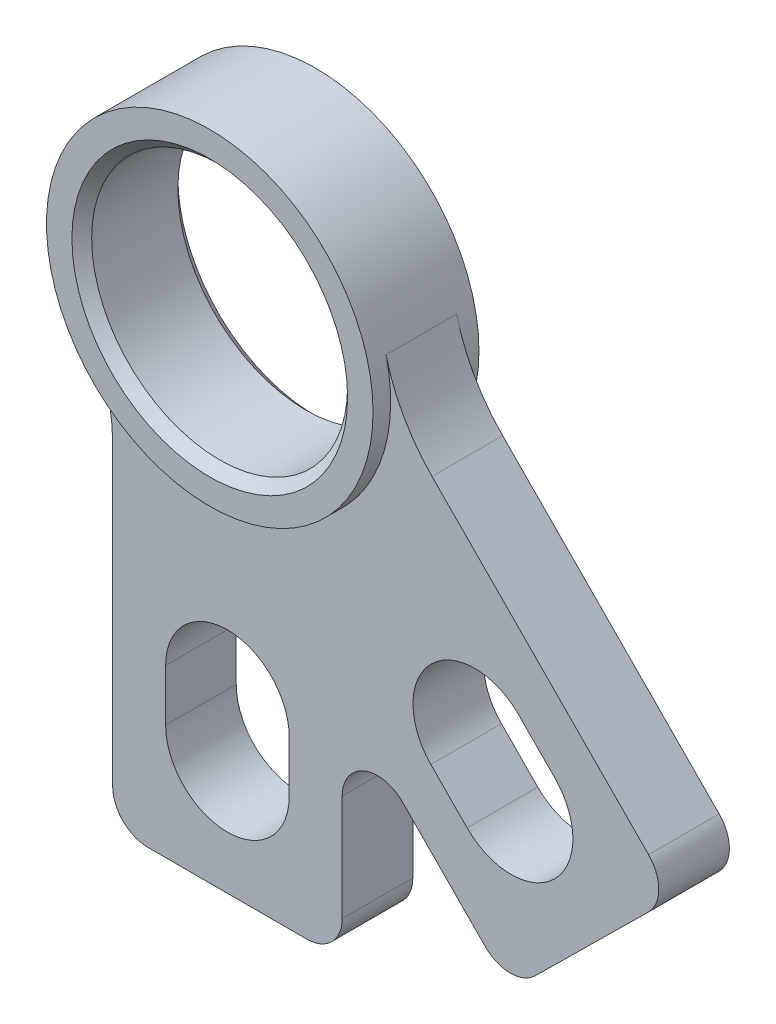
ISO-10303-21;
HEADER;
FILE_DESCRIPTION(('STEP AP214'),'2;1');
FILE_NAME('part.step','',(''),(''),'','','');
FILE_SCHEMA(('AUTOMOTIVE_DESIGN { 1 0 10303 214 1 1 1 1 }'));
ENDSEC;
DATA;
#1=APPLICATION_CONTEXT('core data for automotive mechanical design processes');
#2=APPLICATION_PROTOCOL_DEFINITION('international standard','automotive_design',2000,#1);
#3=PRODUCT_CONTEXT('',#1,'mechanical');
#4=PRODUCT('Part','Part','',(#3));
#5=PRODUCT_RELATED_PRODUCT_CATEGORY('part','',(#4));
#6=PRODUCT_DEFINITION_FORMATION('','',#4);
#7=PRODUCT_DEFINITION_CONTEXT('part definition',#1,'design');
#8=PRODUCT_DEFINITION('design','',#6,#7);
#9=PRODUCT_DEFINITION_SHAPE('','',#8);
#10=(LENGTH_UNIT() NAMED_UNIT(*) SI_UNIT(.MILLI.,.METRE.));
#11=(NAMED_UNIT(*) PLANE_ANGLE_UNIT() SI_UNIT($,.RADIAN.));
#12=(NAMED_UNIT(*) SI_UNIT($,.STERADIAN.) SOLID_ANGLE_UNIT());
#13=UNCERTAINTY_MEASURE_WITH_UNIT(LENGTH_MEASURE(1.E-05),#10,'distance_accuracy_value','');
#14=(GEOMETRIC_REPRESENTATION_CONTEXT(3) GLOBAL_UNCERTAINTY_ASSIGNED_CONTEXT((#13)) GLOBAL_UNIT_ASSIGNED_CONTEXT((#10,
#11,#12)) REPRESENTATION_CONTEXT('',''));
#15=CARTESIAN_POINT('',(0.,0.,0.));
#16=DIRECTION('',(0.,0.,1.));
#17=DIRECTION('',(1.,0.,0.));
#18=AXIS2_PLACEMENT_3D('',#15,#16,#17);
#19=CARTESIAN_POINT('',(0.,0.,4.7625));
#20=DIRECTION('',(0.,0.,-1.));
#21=DIRECTION('',(-1.,0.,0.));
#22=AXIS2_PLACEMENT_3D('',#19,#20,#21);
#23=CYLINDRICAL_SURFACE('',#22,11.5062);
#24=CARTESIAN_POINT('',(0.,0.,-3.87350000000002));
#25=DIRECTION('',(0.,0.,1.));
#26=DIRECTION('',(1.,0.,0.));
#27=AXIS2_PLACEMENT_3D('',#24,#25,#26);
#28=CIRCLE('',#27,11.5062);
#29=CARTESIAN_POINT('',(-11.5062,0.,-3.87350000000002));
#30=VERTEX_POINT('',#29);
#31=EDGE_CURVE('E43',#30,#30,#28,.F.);
#32=CARTESIAN_POINT('',(0.,0.,3.87349999999996));
#33=DIRECTION('',(0.,0.,1.));
#34=DIRECTION('',(1.,0.,0.));
#35=AXIS2_PLACEMENT_3D('',#32,#33,#34);
#36=CIRCLE('',#35,11.5062);
#37=CARTESIAN_POINT('',(-11.5062,0.,3.87349999999996));
#38=VERTEX_POINT('',#37);
#39=EDGE_CURVE('E371',#38,#38,#36,.T.);
#40=CARTESIAN_POINT('',(-11.5062,0.,-3.87350000000002));
#41=CARTESIAN_POINT('',(-11.5062,0.,-3.79280208333335));
#42=CARTESIAN_POINT('',(-11.5062,0.,-3.71210416666669));
#43=CARTESIAN_POINT('',(-11.5062,0.,-3.55070833333335));
#44=CARTESIAN_POINT('',(-11.5062,0.,-3.47001041666669));
#45=CARTESIAN_POINT('',(-11.5062,0.,-3.30861458333335));
#46=CARTESIAN_POINT('',(-11.5062,0.,-3.22791666666669));
#47=CARTESIAN_POINT('',(-11.5062,0.,-3.06652083333336));
#48=CARTESIAN_POINT('',(-11.5062,0.,-2.98582291666669));
#49=CARTESIAN_POINT('',(-11.5062,0.,-2.82442708333336));
#50=CARTESIAN_POINT('',(-11.5062,0.,-2.74372916666669));
#51=CARTESIAN_POINT('',(-11.5062,0.,-2.58233333333336));
#52=CARTESIAN_POINT('',(-11.5062,0.,-2.50163541666669));
#53=CARTESIAN_POINT('',(-11.5062,0.,-2.34023958333336));
#54=CARTESIAN_POINT('',(-11.5062,0.,-2.25954166666669));
#55=CARTESIAN_POINT('',(-11.5062,0.,-2.09814583333336));
#56=CARTESIAN_POINT('',(-11.5062,0.,-2.01744791666669));
#57=CARTESIAN_POINT('',(-11.5062,0.,-1.85605208333336));
#58=CARTESIAN_POINT('',(-11.5062,0.,-1.77535416666669));
#59=CARTESIAN_POINT('',(-11.5062,0.,-1.61395833333336));
#60=CARTESIAN_POINT('',(-11.5062,0.,-1.53326041666669));
#61=CARTESIAN_POINT('',(-11.5062,0.,-1.37186458333336));
#62=CARTESIAN_POINT('',(-11.5062,0.,-1.29116666666669));
#63=CARTESIAN_POINT('',(-11.5062,0.,-1.12977083333336));
#64=CARTESIAN_POINT('',(-11.5062,0.,-1.0490729166667));
#65=CARTESIAN_POINT('',(-11.5062,0.,-0.887677083333363));
#66=CARTESIAN_POINT('',(-11.5062,0.,-0.806979166666696));
#67=CARTESIAN_POINT('',(-11.5062,0.,-0.645583333333363));
#68=CARTESIAN_POINT('',(-11.5062,0.,-0.564885416666697));
#69=CARTESIAN_POINT('',(-11.5062,0.,-0.403489583333364));
#70=CARTESIAN_POINT('',(-11.5062,0.,-0.322791666666698));
#71=CARTESIAN_POINT('',(-11.5062,0.,-0.161395833333365));
#72=CARTESIAN_POINT('',(-11.5062,0.,-0.0806979166666985));
#73=CARTESIAN_POINT('',(-11.5062,0.,0.0806979166666343));
#74=CARTESIAN_POINT('',(-11.5062,0.,0.161395833333301));
#75=CARTESIAN_POINT('',(-11.5062,0.,0.322791666666634));
#76=CARTESIAN_POINT('',(-11.5062,0.,0.4034895833333));
#77=CARTESIAN_POINT('',(-11.5062,0.,0.564885416666633));
#78=CARTESIAN_POINT('',(-11.5062,0.,0.645583333333299));
#79=CARTESIAN_POINT('',(-11.5062,0.,0.806979166666632));
#80=CARTESIAN_POINT('',(-11.5062,0.,0.887677083333298));
#81=CARTESIAN_POINT('',(-11.5062,0.,1.04907291666663));
#82=CARTESIAN_POINT('',(-11.5062,0.,1.1297708333333));
#83=CARTESIAN_POINT('',(-11.5062,0.,1.29116666666663));
#84=CARTESIAN_POINT('',(-11.5062,0.,1.3718645833333));
#85=CARTESIAN_POINT('',(-11.5062,0.,1.53326041666663));
#86=CARTESIAN_POINT('',(-11.5062,0.,1.6139583333333));
#87=CARTESIAN_POINT('',(-11.5062,0.,1.77535416666663));
#88=CARTESIAN_POINT('',(-11.5062,0.,1.8560520833333));
#89=CARTESIAN_POINT('',(-11.5062,0.,2.01744791666663));
#90=CARTESIAN_POINT('',(-11.5062,0.,2.0981458333333));
#91=CARTESIAN_POINT('',(-11.5062,0.,2.25954166666663));
#92=CARTESIAN_POINT('',(-11.5062,0.,2.34023958333329));
#93=CARTESIAN_POINT('',(-11.5062,0.,2.50163541666663));
#94=CARTESIAN_POINT('',(-11.5062,0.,2.58233333333329));
#95=CARTESIAN_POINT('',(-11.5062,0.,2.74372916666663));
#96=CARTESIAN_POINT('',(-11.5062,0.,2.82442708333329));
#97=CARTESIAN_POINT('',(-11.5062,0.,2.98582291666663));
#98=CARTESIAN_POINT('',(-11.5062,0.,3.06652083333329));
#99=CARTESIAN_POINT('',(-11.5062,0.,3.22791666666662));
#100=CARTESIAN_POINT('',(-11.5062,0.,3.30861458333329));
#101=CARTESIAN_POINT('',(-11.5062,0.,3.47001041666662));
#102=CARTESIAN_POINT('',(-11.5062,0.,3.55070833333329));
#103=CARTESIAN_POINT('',(-11.5062,0.,3.71210416666662));
#104=CARTESIAN_POINT('',(-11.5062,0.,3.79280208333329));
#105=CARTESIAN_POINT('',(-11.5062,0.,3.87349999999996));
#106=B_SPLINE_CURVE_WITH_KNOTS('',3,(#40,#41,#42,#43,#44,#45,#46,#47,#48,#49,#50,#51,#52,#53,
#54,#55,#56,#57,#58,#59,#60,#61,#62,#63,#64,#65,#66,#67,#68,#69,#70,#71,#72,#73,#74,#75,#76,#77,
#78,#79,#80,#81,#82,#83,#84,#85,#86,#87,#88,#89,#90,#91,#92,#93,#94,#95,#96,#97,#98,#99,#100,
#101,#102,#103,#104,#105),.UNSPECIFIED.,.F.,.F.,(4,2,2,2,2,2,2,2,2,2,2,2,2,2,2,2,2,2,2,2,2,2,2,
2,2,2,2,2,2,2,2,2,4),(0.,0.24209375,0.484187499999998,0.726281249999999,0.968374999999996,
1.21046875,1.45256249999999,1.69465624999999,1.93674999999999,2.17884374999999,2.42093749999999,
2.66303124999999,2.90512499999999,3.14721874999999,3.38931249999999,3.63140624999999,
3.87349999999999,4.11559374999999,4.35768749999999,4.59978124999999,4.84187499999998,
5.08396874999998,5.32606249999998,5.56815624999998,5.81024999999998,6.05234374999998,
6.29443749999998,6.53653124999998,6.77862499999998,7.02071874999998,7.26281249999998,
7.50490624999998,7.74699999999998),.UNSPECIFIED.);
#107=EDGE_CURVE('BSEAM35',#30,#38,#106,.T.);
#108=ORIENTED_EDGE('',*,*,#31,.T.);
#109=ORIENTED_EDGE('',*,*,#39,.T.);
#110=ORIENTED_EDGE('',*,*,#107,.T.);
#111=ORIENTED_EDGE('',*,*,#107,.F.);
#112=EDGE_LOOP('',(#108,#110,#109,#111));
#113=FACE_BOUND('',#112,.T.);
#114=ADVANCED_FACE('F35',(#113),#23,.F.);
#115=CARTESIAN_POINT('',(0.,0.,4.7625));
#116=DIRECTION('',(0.,0.,-1.));
#117=DIRECTION('',(-1.,0.,0.));
#118=AXIS2_PLACEMENT_3D('',#115,#116,#117);
#119=CYLINDRICAL_SURFACE('',#118,14.6812);
#120=DIRECTION('',(0.,0.,-1.));
#121=VECTOR('',#120,1.);
#122=CARTESIAN_POINT('',(-12.5851932668321,-7.55979787272683,3.175));
#123=LINE('',#122,#121);
#124=CARTESIAN_POINT('',(-12.5851932668321,-7.55979787272682,3.175));
#125=VERTEX_POINT('',#124);
#126=CARTESIAN_POINT('',(-12.5851932668321,-7.55979787272683,-3.175));
#127=VERTEX_POINT('',#126);
#128=EDGE_CURVE('E198',#125,#127,#123,.T.);
#129=ORIENTED_EDGE('',*,*,#128,.F.);
#130=CARTESIAN_POINT('',(0.,0.,3.175));
#131=DIRECTION('',(0.,0.,1.));
#132=DIRECTION('',(1.,0.,0.));
#133=AXIS2_PLACEMENT_3D('',#130,#131,#132);
#134=CIRCLE('',#133,14.6812);
#135=CARTESIAN_POINT('',(14.2666109532849,3.46431022681427,3.175));
#136=VERTEX_POINT('',#135);
#137=EDGE_CURVE('E214',#125,#136,#134,.T.);
#138=ORIENTED_EDGE('',*,*,#137,.T.);
#139=DIRECTION('',(0.,0.,-1.));
#140=VECTOR('',#139,1.);
#141=CARTESIAN_POINT('',(14.266610953285,3.46431022681425,3.175));
#142=LINE('',#141,#140);
#143=CARTESIAN_POINT('',(14.266610953285,3.46431022681425,-3.175));
#144=VERTEX_POINT('',#143);
#145=EDGE_CURVE('E254',#136,#144,#142,.T.);
#146=ORIENTED_EDGE('',*,*,#145,.T.);
#147=CARTESIAN_POINT('',(0.,0.,-3.175));
#148=DIRECTION('',(0.,0.,1.));
#149=DIRECTION('',(1.,0.,0.));
#150=AXIS2_PLACEMENT_3D('',#147,#148,#149);
#151=CIRCLE('',#150,14.6812);
#152=EDGE_CURVE('E255',#127,#144,#151,.T.);
#153=ORIENTED_EDGE('',*,*,#152,.F.);
#154=EDGE_LOOP('',(#129,#138,#146,#153));
#155=FACE_BOUND('',#154,.T.);
#156=CARTESIAN_POINT('',(0.,0.,4.7625));
#157=DIRECTION('',(0.,0.,1.));
#158=DIRECTION('',(1.,0.,0.));
#159=AXIS2_PLACEMENT_3D('',#156,#157,#158);
#160=CIRCLE('',#159,14.6812);
#161=CARTESIAN_POINT('',(14.6812,0.,4.7625));
#162=VERTEX_POINT('',#161);
#163=EDGE_CURVE('E321',#162,#162,#160,.T.);
#164=ORIENTED_EDGE('',*,*,#163,.F.);
#165=EDGE_LOOP('',(#164));
#166=FACE_BOUND('',#165,.T.);
#167=CARTESIAN_POINT('',(0.,0.,-4.7625));
#168=DIRECTION('',(0.,0.,1.));
#169=DIRECTION('',(1.,0.,0.));
#170=AXIS2_PLACEMENT_3D('',#167,#168,#169);
#171=CIRCLE('',#170,14.6812);
#172=CARTESIAN_POINT('',(14.6812,0.,-4.7625));
#173=VERTEX_POINT('',#172);
#174=EDGE_CURVE('E309',#173,#173,#171,.T.);
#175=ORIENTED_EDGE('',*,*,#174,.T.);
#176=EDGE_LOOP('',(#175));
#177=FACE_BOUND('',#176,.T.);
#178=ADVANCED_FACE('F392',(#155,#166,#177),#119,.T.);
#179=CARTESIAN_POINT('',(0.,0.,4.7625));
#180=DIRECTION('',(0.,0.,1.));
#181=DIRECTION('',(1.,0.,0.));
#182=AXIS2_PLACEMENT_3D('',#179,#180,#181);
#183=PLANE('',#182);
#184=CARTESIAN_POINT('',(0.,0.,4.7625));
#185=DIRECTION('',(0.,0.,1.));
#186=DIRECTION('',(1.,0.,0.));
#187=AXIS2_PLACEMENT_3D('',#184,#185,#186);
#188=CIRCLE('',#187,12.3952);
#189=CARTESIAN_POINT('',(12.3952,0.,4.7625));
#190=VERTEX_POINT('',#189);
#191=EDGE_CURVE('E11',#190,#190,#188,.F.);
#192=ORIENTED_EDGE('',*,*,#191,.T.);
#193=EDGE_LOOP('',(#192));
#194=FACE_BOUND('',#193,.T.);
#195=ORIENTED_EDGE('',*,*,#163,.T.);
#196=EDGE_LOOP('',(#195));
#197=FACE_BOUND('',#196,.T.);
#198=ADVANCED_FACE('F388',(#194,#197),#183,.T.);
#199=CARTESIAN_POINT('',(0.,0.,-4.7625));
#200=DIRECTION('',(0.,0.,1.));
#201=DIRECTION('',(1.,0.,0.));
#202=AXIS2_PLACEMENT_3D('',#199,#200,#201);
#203=PLANE('',#202);
#204=CARTESIAN_POINT('',(0.,0.,-4.7625));
#205=DIRECTION('',(0.,0.,1.));
#206=DIRECTION('',(1.,0.,0.));
#207=AXIS2_PLACEMENT_3D('',#204,#205,#206);
#208=CIRCLE('',#207,12.3952);
#209=CARTESIAN_POINT('',(-12.3952,0.,-4.7625));
#210=VERTEX_POINT('',#209);
#211=EDGE_CURVE('E368',#210,#210,#208,.T.);
#212=ORIENTED_EDGE('',*,*,#211,.T.);
#213=EDGE_LOOP('',(#212));
#214=FACE_BOUND('',#213,.T.);
#215=ORIENTED_EDGE('',*,*,#174,.F.);
#216=EDGE_LOOP('',(#215));
#217=FACE_BOUND('',#216,.T.);
#218=ADVANCED_FACE('F384',(#214,#217),#203,.F.);
#219=CARTESIAN_POINT('',(0.,-30.6387499999984,3.175));
#220=DIRECTION('',(0.,0.,-1.));
#221=DIRECTION('',(-1.,0.,0.));
#222=AXIS2_PLACEMENT_3D('',#219,#220,#221);
#223=CYLINDRICAL_SURFACE('',#222,5.55624999999839);
#224=CARTESIAN_POINT('',(0.,-30.6387499999984,-3.175));
#225=DIRECTION('',(0.,0.,1.));
#226=DIRECTION('',(1.,0.,0.));
#227=AXIS2_PLACEMENT_3D('',#224,#225,#226);
#228=CIRCLE('',#227,5.55624999999839);
#229=CARTESIAN_POINT('',(5.55624999999834,-30.6387499999984,-3.175));
#230=VERTEX_POINT('',#229);
#231=CARTESIAN_POINT('',(-5.55624999999845,-30.6387499999984,-3.175));
#232=VERTEX_POINT('',#231);
#233=EDGE_CURVE('E289',#230,#232,#228,.T.);
#234=ORIENTED_EDGE('',*,*,#233,.F.);
#235=DIRECTION('',(0.,0.,-1.));
#236=VECTOR('',#235,1.);
#237=CARTESIAN_POINT('',(5.55624999999834,-30.6387499999984,3.175));
#238=LINE('',#237,#236);
#239=CARTESIAN_POINT('',(5.55624999999834,-30.6387499999984,3.175));
#240=VERTEX_POINT('',#239);
#241=EDGE_CURVE('E307',#240,#230,#238,.T.);
#242=ORIENTED_EDGE('',*,*,#241,.F.);
#243=CARTESIAN_POINT('',(0.,-30.6387499999984,3.175));
#244=DIRECTION('',(0.,0.,1.));
#245=DIRECTION('',(1.,0.,0.));
#246=AXIS2_PLACEMENT_3D('',#243,#244,#245);
#247=CIRCLE('',#246,5.55624999999839);
#248=CARTESIAN_POINT('',(-5.55624999999845,-30.6387499999984,3.175));
#249=VERTEX_POINT('',#248);
#250=EDGE_CURVE('E243',#240,#249,#247,.T.);
#251=ORIENTED_EDGE('',*,*,#250,.T.);
#252=DIRECTION('',(0.,0.,-1.));
#253=VECTOR('',#252,1.);
#254=CARTESIAN_POINT('',(-5.55624999999845,-30.6387499999984,3.175));
#255=LINE('',#254,#253);
#256=EDGE_CURVE('E300',#249,#232,#255,.T.);
#257=ORIENTED_EDGE('',*,*,#256,.T.);
#258=EDGE_LOOP('',(#234,#242,#251,#257));
#259=FACE_BOUND('',#258,.T.);
#260=ADVANCED_FACE('F387',(#259),#223,.F.);
#261=CARTESIAN_POINT('',(5.55624999999835,0.,3.175));
#262=DIRECTION('',(-1.,0.,0.));
#263=DIRECTION('',(0.,-1.,0.));
#264=AXIS2_PLACEMENT_3D('',#261,#262,#263);
#265=PLANE('',#264);
#266=DIRECTION('',(0.,1.,0.));
#267=VECTOR('',#266,1.);
#268=CARTESIAN_POINT('',(5.55624999999835,0.,-3.175));
#269=LINE('',#268,#267);
#270=CARTESIAN_POINT('',(5.55624999999834,-35.286077056792,-3.175));
#271=VERTEX_POINT('',#270);
#272=EDGE_CURVE('E292',#271,#230,#269,.T.);
#273=ORIENTED_EDGE('',*,*,#272,.F.);
#274=DIRECTION('',(0.,0.,-1.));
#275=VECTOR('',#274,1.);
#276=CARTESIAN_POINT('',(5.55624999999834,-35.286077056792,3.175));
#277=LINE('',#276,#275);
#278=CARTESIAN_POINT('',(5.55624999999834,-35.286077056792,3.175));
#279=VERTEX_POINT('',#278);
#280=EDGE_CURVE('E305',#279,#271,#277,.T.);
#281=ORIENTED_EDGE('',*,*,#280,.F.);
#282=DIRECTION('',(0.,1.,0.));
#283=VECTOR('',#282,1.);
#284=CARTESIAN_POINT('',(5.55624999999835,0.,3.175));
#285=LINE('',#284,#283);
#286=EDGE_CURVE('E246',#279,#240,#285,.T.);
#287=ORIENTED_EDGE('',*,*,#286,.T.);
#288=ORIENTED_EDGE('',*,*,#241,.T.);
#289=EDGE_LOOP('',(#273,#281,#287,#288));
#290=FACE_BOUND('',#289,.T.);
#291=ADVANCED_FACE('F530',(#290),#265,.T.);
#292=CARTESIAN_POINT('',(0.,-35.286077056792,3.175));
#293=DIRECTION('',(0.,0.,-1.));
#294=DIRECTION('',(-1.,0.,0.));
#295=AXIS2_PLACEMENT_3D('',#292,#293,#294);
#296=CYLINDRICAL_SURFACE('',#295,5.55624999999839);
#297=CARTESIAN_POINT('',(0.,-35.286077056792,-3.175));
#298=DIRECTION('',(0.,0.,1.));
#299=DIRECTION('',(1.,0.,0.));
#300=AXIS2_PLACEMENT_3D('',#297,#298,#299);
#301=CIRCLE('',#300,5.55624999999839);
#302=CARTESIAN_POINT('',(-5.55624999999845,-35.286077056792,-3.175));
#303=VERTEX_POINT('',#302);
#304=EDGE_CURVE('E295',#303,#271,#301,.T.);
#305=ORIENTED_EDGE('',*,*,#304,.F.);
#306=DIRECTION('',(0.,0.,-1.));
#307=VECTOR('',#306,1.);
#308=CARTESIAN_POINT('',(-5.55624999999845,-35.286077056792,3.175));
#309=LINE('',#308,#307);
#310=CARTESIAN_POINT('',(-5.55624999999845,-35.286077056792,3.175));
#311=VERTEX_POINT('',#310);
#312=EDGE_CURVE('E302',#311,#303,#309,.T.);
#313=ORIENTED_EDGE('',*,*,#312,.F.);
#314=CARTESIAN_POINT('',(0.,-35.286077056792,3.175));
#315=DIRECTION('',(0.,0.,1.));
#316=DIRECTION('',(1.,0.,0.));
#317=AXIS2_PLACEMENT_3D('',#314,#315,#316);
#318=CIRCLE('',#317,5.55624999999839);
#319=EDGE_CURVE('E249',#311,#279,#318,.T.);
#320=ORIENTED_EDGE('',*,*,#319,.T.);
#321=ORIENTED_EDGE('',*,*,#280,.T.);
#322=EDGE_LOOP('',(#305,#313,#320,#321));
#323=FACE_BOUND('',#322,.T.);
#324=ADVANCED_FACE('F497',(#323),#296,.F.);
#325=CARTESIAN_POINT('',(22.2428255569073,-22.5228752340236,3.175));
#326=DIRECTION('',(0.,0.,-1.));
#327=DIRECTION('',(-1.,0.,0.));
#328=AXIS2_PLACEMENT_3D('',#325,#326,#327);
#329=CYLINDRICAL_SURFACE('',#328,5.55624999999837);
#330=CARTESIAN_POINT('',(22.2428255569073,-22.5228752340236,-3.175));
#331=DIRECTION('',(0.,0.,1.));
#332=DIRECTION('',(1.,0.,0.));
#333=AXIS2_PLACEMENT_3D('',#330,#331,#332);
#334=CIRCLE('',#333,5.55624999999837);
#335=CARTESIAN_POINT('',(26.1961888126276,-18.6186681402846,-3.175));
#336=VERTEX_POINT('',#335);
#337=CARTESIAN_POINT('',(18.289462301187,-26.4270823277627,-3.175));
#338=VERTEX_POINT('',#337);
#339=EDGE_CURVE('E277',#336,#338,#334,.T.);
#340=ORIENTED_EDGE('',*,*,#339,.F.);
#341=DIRECTION('',(0.,0.,-1.));
#342=VECTOR('',#341,1.);
#343=CARTESIAN_POINT('',(26.1961888126276,-18.6186681402846,3.175));
#344=LINE('',#343,#342);
#345=CARTESIAN_POINT('',(26.1961888126276,-18.6186681402846,3.175));
#346=VERTEX_POINT('',#345);
#347=EDGE_CURVE('E303',#346,#336,#344,.T.);
#348=ORIENTED_EDGE('',*,*,#347,.F.);
#349=CARTESIAN_POINT('',(22.2428255569073,-22.5228752340236,3.175));
#350=DIRECTION('',(0.,0.,1.));
#351=DIRECTION('',(1.,0.,0.));
#352=AXIS2_PLACEMENT_3D('',#349,#350,#351);
#353=CIRCLE('',#352,5.55624999999837);
#354=CARTESIAN_POINT('',(18.289462301187,-26.4270823277627,3.175));
#355=VERTEX_POINT('',#354);
#356=EDGE_CURVE('E232',#346,#355,#353,.T.);
#357=ORIENTED_EDGE('',*,*,#356,.T.);
#358=DIRECTION('',(0.,0.,-1.));
#359=VECTOR('',#358,1.);
#360=CARTESIAN_POINT('',(18.289462301187,-26.4270823277627,3.175));
#361=LINE('',#360,#359);
#362=EDGE_CURVE('E310',#355,#338,#361,.T.);
#363=ORIENTED_EDGE('',*,*,#362,.T.);
#364=EDGE_LOOP('',(#340,#348,#357,#363));
#365=FACE_BOUND('',#364,.T.);
#366=ADVANCED_FACE('F489',(#365),#329,.F.);
#367=CARTESIAN_POINT('',(3.95336325572036,3.90420709373906,3.175));
#368=DIRECTION('',(-0.71151644647406,-0.702669443192833,0.));
#369=DIRECTION('',(0.702669443192833,-0.71151644647406,0.));
#370=AXIS2_PLACEMENT_3D('',#367,#368,#369);
#371=PLANE('',#370);
#372=DIRECTION('',(-0.702669443192833,0.71151644647406,0.));
#373=VECTOR('',#372,1.);
#374=CARTESIAN_POINT('',(3.95336325572036,3.90420709373906,-3.175));
#375=LINE('',#374,#373);
#376=CARTESIAN_POINT('',(29.4617235279598,-21.9253177733372,-3.175));
#377=VERTEX_POINT('',#376);
#378=EDGE_CURVE('E280',#377,#336,#375,.T.);
#379=ORIENTED_EDGE('',*,*,#378,.F.);
#380=DIRECTION('',(0.,0.,-1.));
#381=VECTOR('',#380,1.);
#382=CARTESIAN_POINT('',(29.4617235279598,-21.9253177733372,3.175));
#383=LINE('',#382,#381);
#384=CARTESIAN_POINT('',(29.4617235279598,-21.9253177733372,3.175));
#385=VERTEX_POINT('',#384);
#386=EDGE_CURVE('E314',#385,#377,#383,.T.);
#387=ORIENTED_EDGE('',*,*,#386,.F.);
#388=DIRECTION('',(-0.702669443192833,0.71151644647406,0.));
#389=VECTOR('',#388,1.);
#390=CARTESIAN_POINT('',(3.95336325572036,3.90420709373906,3.175));
#391=LINE('',#390,#389);
#392=EDGE_CURVE('E235',#385,#346,#391,.T.);
#393=ORIENTED_EDGE('',*,*,#392,.T.);
#394=ORIENTED_EDGE('',*,*,#347,.T.);
#395=EDGE_LOOP('',(#379,#387,#393,#394));
#396=FACE_BOUND('',#395,.T.);
#397=ADVANCED_FACE('F483',(#396),#371,.T.);
#398=CARTESIAN_POINT('',(25.5083602722395,-25.8295248670762,3.175));
#399=DIRECTION('',(0.,0.,-1.));
#400=DIRECTION('',(-1.,0.,0.));
#401=AXIS2_PLACEMENT_3D('',#398,#399,#400);
#402=CYLINDRICAL_SURFACE('',#401,5.55624999999837);
#403=CARTESIAN_POINT('',(25.5083602722395,-25.8295248670762,-3.175));
#404=DIRECTION('',(0.,0.,1.));
#405=DIRECTION('',(1.,0.,0.));
#406=AXIS2_PLACEMENT_3D('',#403,#404,#405);
#407=CIRCLE('',#406,5.55624999999837);
#408=CARTESIAN_POINT('',(21.5549970165191,-29.7337319608152,-3.175));
#409=VERTEX_POINT('',#408);
#410=EDGE_CURVE('E283',#409,#377,#407,.T.);
#411=ORIENTED_EDGE('',*,*,#410,.F.);
#412=DIRECTION('',(0.,0.,-1.));
#413=VECTOR('',#412,1.);
#414=CARTESIAN_POINT('',(21.5549970165191,-29.7337319608152,3.175));
#415=LINE('',#414,#413);
#416=CARTESIAN_POINT('',(21.5549970165191,-29.7337319608152,3.175));
#417=VERTEX_POINT('',#416);
#418=EDGE_CURVE('E312',#417,#409,#415,.T.);
#419=ORIENTED_EDGE('',*,*,#418,.F.);
#420=CARTESIAN_POINT('',(25.5083602722395,-25.8295248670762,3.175));
#421=DIRECTION('',(0.,0.,1.));
#422=DIRECTION('',(1.,0.,0.));
#423=AXIS2_PLACEMENT_3D('',#420,#421,#422);
#424=CIRCLE('',#423,5.55624999999837);
#425=EDGE_CURVE('E238',#417,#385,#424,.T.);
#426=ORIENTED_EDGE('',*,*,#425,.T.);
#427=ORIENTED_EDGE('',*,*,#386,.T.);
#428=EDGE_LOOP('',(#411,#419,#426,#427));
#429=FACE_BOUND('',#428,.T.);
#430=ADVANCED_FACE('F479',(#429),#402,.F.);
#431=CARTESIAN_POINT('',(-26.1937499999968,-15.7343197939272,3.175));
#432=DIRECTION('',(0.,0.,-1.));
#433=DIRECTION('',(-1.,0.,0.));
#434=AXIS2_PLACEMENT_3D('',#431,#432,#433);
#435=CYLINDRICAL_SURFACE('',#434,15.8749999999984);
#436=CARTESIAN_POINT('',(-26.1937499999968,-15.7343197939272,-3.175));
#437=DIRECTION('',(0.,0.,1.));
#438=DIRECTION('',(1.,0.,0.));
#439=AXIS2_PLACEMENT_3D('',#436,#437,#438);
#440=CIRCLE('',#439,15.8749999999984);
#441=CARTESIAN_POINT('',(-10.3187499999984,-15.7343197939272,-3.175));
#442=VERTEX_POINT('',#441);
#443=EDGE_CURVE('E194',#442,#127,#440,.T.);
#444=ORIENTED_EDGE('',*,*,#443,.F.);
#445=DIRECTION('',(0.,0.,-1.));
#446=VECTOR('',#445,1.);
#447=CARTESIAN_POINT('',(-10.3187499999984,-15.7343197939272,3.175));
#448=LINE('',#447,#446);
#449=CARTESIAN_POINT('',(-10.3187499999984,-15.7343197939272,3.175));
#450=VERTEX_POINT('',#449);
#451=EDGE_CURVE('E187',#450,#442,#448,.T.);
#452=ORIENTED_EDGE('',*,*,#451,.F.);
#453=CARTESIAN_POINT('',(-26.1937499999968,-15.7343197939272,3.175));
#454=DIRECTION('',(0.,0.,1.));
#455=DIRECTION('',(1.,0.,0.));
#456=AXIS2_PLACEMENT_3D('',#453,#454,#455);
#457=CIRCLE('',#456,15.8749999999984);
#458=EDGE_CURVE('E192',#450,#125,#457,.T.);
#459=ORIENTED_EDGE('',*,*,#458,.T.);
#460=ORIENTED_EDGE('',*,*,#128,.T.);
#461=EDGE_LOOP('',(#444,#452,#459,#460));
#462=FACE_BOUND('',#461,.T.);
#463=ADVANCED_FACE('F189',(#462),#435,.F.);
#464=CARTESIAN_POINT('',(-10.3187499999984,0.,3.175));
#465=DIRECTION('',(1.,0.,0.));
#466=DIRECTION('',(0.,1.,0.));
#467=AXIS2_PLACEMENT_3D('',#464,#465,#466);
#468=PLANE('',#467);
#469=DIRECTION('',(0.,-1.,0.));
#470=VECTOR('',#469,1.);
#471=CARTESIAN_POINT('',(-10.3187499999984,0.,-3.175));
#472=LINE('',#471,#470);
#473=CARTESIAN_POINT('',(-10.3187499999985,-42.4298270567904,-3.175));
#474=VERTEX_POINT('',#473);
#475=EDGE_CURVE('E259',#442,#474,#472,.T.);
#476=ORIENTED_EDGE('',*,*,#475,.T.);
#477=DIRECTION('',(0.,0.,-1.));
#478=VECTOR('',#477,1.);
#479=CARTESIAN_POINT('',(-10.3187499999985,-42.4298270567904,3.175));
#480=LINE('',#479,#478);
#481=CARTESIAN_POINT('',(-10.3187499999985,-42.4298270567904,3.175));
#482=VERTEX_POINT('',#481);
#483=EDGE_CURVE('E205',#474,#482,#480,.F.);
#484=ORIENTED_EDGE('',*,*,#483,.T.);
#485=DIRECTION('',(0.,-1.,0.));
#486=VECTOR('',#485,1.);
#487=CARTESIAN_POINT('',(-10.3187499999984,0.,3.175));
#488=LINE('',#487,#486);
#489=EDGE_CURVE('E202',#450,#482,#488,.T.);
#490=ORIENTED_EDGE('',*,*,#489,.F.);
#491=ORIENTED_EDGE('',*,*,#451,.T.);
#492=EDGE_LOOP('',(#476,#484,#490,#491));
#493=FACE_BOUND('',#492,.T.);
#494=ADVANCED_FACE('F203',(#493),#468,.F.);
#495=CARTESIAN_POINT('',(0.,-45.6048270567904,3.175));
#496=DIRECTION('',(0.,1.,0.));
#497=DIRECTION('',(-1.,0.,0.));
#498=AXIS2_PLACEMENT_3D('',#495,#496,#497);
#499=PLANE('',#498);
#500=DIRECTION('',(1.,0.,0.));
#501=VECTOR('',#500,1.);
#502=CARTESIAN_POINT('',(0.,-45.6048270567904,-3.175));
#503=LINE('',#502,#501);
#504=CARTESIAN_POINT('',(-7.14374999999846,-45.6048270567903,-3.175));
#505=VERTEX_POINT('',#504);
#506=CARTESIAN_POINT('',(7.14374999999835,-45.6048270567904,-3.175));
#507=VERTEX_POINT('',#506);
#508=EDGE_CURVE('E261',#505,#507,#503,.T.);
#509=ORIENTED_EDGE('',*,*,#508,.T.);
#510=DIRECTION('',(0.,0.,-1.));
#511=VECTOR('',#510,1.);
#512=CARTESIAN_POINT('',(7.14374999999835,-45.6048270567904,3.175));
#513=LINE('',#512,#511);
#514=CARTESIAN_POINT('',(7.14374999999835,-45.6048270567904,3.175));
#515=VERTEX_POINT('',#514);
#516=EDGE_CURVE('E58',#507,#515,#513,.F.);
#517=ORIENTED_EDGE('',*,*,#516,.T.);
#518=DIRECTION('',(1.,0.,0.));
#519=VECTOR('',#518,1.);
#520=CARTESIAN_POINT('',(0.,-45.6048270567904,3.175));
#521=LINE('',#520,#519);
#522=CARTESIAN_POINT('',(-7.14374999999846,-45.6048270567903,3.175));
#523=VERTEX_POINT('',#522);
#524=EDGE_CURVE('E207',#523,#515,#521,.T.);
#525=ORIENTED_EDGE('',*,*,#524,.F.);
#526=DIRECTION('',(0.,0.,-1.));
#527=VECTOR('',#526,1.);
#528=CARTESIAN_POINT('',(-7.14374999999846,-45.6048270567903,3.175));
#529=LINE('',#528,#527);
#530=EDGE_CURVE('E356',#523,#505,#529,.T.);
#531=ORIENTED_EDGE('',*,*,#530,.T.);
#532=EDGE_LOOP('',(#509,#517,#525,#531));
#533=FACE_BOUND('',#532,.T.);
#534=ADVANCED_FACE('F443',(#533),#499,.F.);
#535=CARTESIAN_POINT('',(10.3187499999988,-1.10175990461723E-13,3.175));
#536=DIRECTION('',(-1.,0.,0.));
#537=DIRECTION('',(0.,-1.,0.));
#538=AXIS2_PLACEMENT_3D('',#535,#536,#537);
#539=PLANE('',#538);
#540=DIRECTION('',(0.,1.,0.));
#541=VECTOR('',#540,1.);
#542=CARTESIAN_POINT('',(10.3187499999988,-1.10175990461723E-13,-3.175));
#543=LINE('',#542,#541);
#544=CARTESIAN_POINT('',(10.3187499999984,-42.4298270567904,-3.175));
#545=VERTEX_POINT('',#544);
#546=CARTESIAN_POINT('',(10.3187499999985,-32.8671970488244,-3.175));
#547=VERTEX_POINT('',#546);
#548=EDGE_CURVE('E263',#545,#547,#543,.T.);
#549=ORIENTED_EDGE('',*,*,#548,.T.);
#550=DIRECTION('',(0.,0.,-1.));
#551=VECTOR('',#550,1.);
#552=CARTESIAN_POINT('',(10.3187499999985,-32.8671970488244,3.175));
#553=LINE('',#552,#551);
#554=CARTESIAN_POINT('',(10.3187499999985,-32.8671970488244,3.175));
#555=VERTEX_POINT('',#554);
#556=EDGE_CURVE('E334',#547,#555,#553,.F.);
#557=ORIENTED_EDGE('',*,*,#556,.T.);
#558=DIRECTION('',(0.,1.,0.));
#559=VECTOR('',#558,1.);
#560=CARTESIAN_POINT('',(10.3187499999988,-1.10175990461723E-13,3.175));
#561=LINE('',#560,#559);
#562=CARTESIAN_POINT('',(10.3187499999984,-42.4298270567904,3.175));
#563=VERTEX_POINT('',#562);
#564=EDGE_CURVE('E220',#563,#555,#561,.T.);
#565=ORIENTED_EDGE('',*,*,#564,.F.);
#566=DIRECTION('',(0.,0.,-1.));
#567=VECTOR('',#566,1.);
#568=CARTESIAN_POINT('',(10.3187499999984,-42.4298270567904,3.175));
#569=LINE('',#568,#567);
#570=EDGE_CURVE('E331',#563,#545,#569,.T.);
#571=ORIENTED_EDGE('',*,*,#570,.T.);
#572=EDGE_LOOP('',(#549,#557,#565,#571));
#573=FACE_BOUND('',#572,.T.);
#574=ADVANCED_FACE('F448',(#573),#539,.F.);
#575=CARTESIAN_POINT('',(-7.34196033205303,-7.25067031694489,3.175));
#576=DIRECTION('',(-0.71151644647406,-0.702669443192833,0.));
#577=DIRECTION('',(0.702669443192833,-0.71151644647406,0.));
#578=AXIS2_PLACEMENT_3D('',#575,#576,#577);
#579=PLANE('',#578);
#580=DIRECTION('',(-0.702669443192833,0.71151644647406,0.));
#581=VECTOR('',#580,1.);
#582=CARTESIAN_POINT('',(-7.34196033205303,-7.25067031694489,3.175));
#583=LINE('',#582,#581);
#584=CARTESIAN_POINT('',(23.1860947749941,-38.163090798519,3.175));
#585=VERTEX_POINT('',#584);
#586=CARTESIAN_POINT('',(15.7528147175536,-30.6362215666872,3.175));
#587=VERTEX_POINT('',#586);
#588=EDGE_CURVE('E223',#585,#587,#583,.T.);
#589=ORIENTED_EDGE('',*,*,#588,.T.);
#590=DIRECTION('',(0.,0.,-1.));
#591=VECTOR('',#590,1.);
#592=CARTESIAN_POINT('',(15.7528147175536,-30.6362215666872,3.175));
#593=LINE('',#592,#591);
#594=CARTESIAN_POINT('',(15.7528147175536,-30.6362215666872,-3.175));
#595=VERTEX_POINT('',#594);
#596=EDGE_CURVE('E328',#587,#595,#593,.T.);
#597=ORIENTED_EDGE('',*,*,#596,.T.);
#598=DIRECTION('',(-0.702669443192833,0.71151644647406,0.));
#599=VECTOR('',#598,1.);
#600=CARTESIAN_POINT('',(-7.34196033205303,-7.25067031694489,-3.175));
#601=LINE('',#600,#599);
#602=CARTESIAN_POINT('',(23.1860947749941,-38.163090798519,-3.175));
#603=VERTEX_POINT('',#602);
#604=EDGE_CURVE('E266',#603,#595,#601,.T.);
#605=ORIENTED_EDGE('',*,*,#604,.F.);
#606=DIRECTION('',(0.,0.,-1.));
#607=VECTOR('',#606,1.);
#608=CARTESIAN_POINT('',(23.1860947749941,-38.163090798519,3.175));
#609=LINE('',#608,#607);
#610=EDGE_CURVE('E324',#603,#585,#609,.F.);
#611=ORIENTED_EDGE('',*,*,#610,.T.);
#612=EDGE_LOOP('',(#589,#597,#605,#611));
#613=FACE_BOUND('',#612,.T.);
#614=ADVANCED_FACE('F454',(#613),#579,.T.);
#615=CARTESIAN_POINT('',(32.7590305891843,-33.1714851991293,3.175));
#616=DIRECTION('',(-0.702669443192833,0.71151644647406,0.));
#617=DIRECTION('',(-0.71151644647406,-0.702669443192833,0.));
#618=AXIS2_PLACEMENT_3D('',#615,#616,#617);
#619=PLANE('',#618);
#620=DIRECTION('',(0.71151644647406,0.702669443192833,0.));
#621=VECTOR('',#620,1.);
#622=CARTESIAN_POINT('',(32.7590305891843,-33.1714851991293,3.175));
#623=LINE('',#622,#621);
#624=CARTESIAN_POINT('',(27.6761349746865,-38.1911800339369,3.175));
#625=VERTEX_POINT('',#624);
#626=CARTESIAN_POINT('',(37.8419262036823,-28.1517903643216,3.175));
#627=VERTEX_POINT('',#626);
#628=EDGE_CURVE('E226',#625,#627,#623,.T.);
#629=ORIENTED_EDGE('',*,*,#628,.F.);
#630=DIRECTION('',(0.,0.,-1.));
#631=VECTOR('',#630,1.);
#632=CARTESIAN_POINT('',(27.6761349746865,-38.1911800339369,-3.175));
#633=LINE('',#632,#631);
#634=CARTESIAN_POINT('',(27.6761349746865,-38.1911800339369,-3.175));
#635=VERTEX_POINT('',#634);
#636=EDGE_CURVE('E338',#625,#635,#633,.T.);
#637=ORIENTED_EDGE('',*,*,#636,.T.);
#638=DIRECTION('',(0.71151644647406,0.702669443192833,0.));
#639=VECTOR('',#638,1.);
#640=CARTESIAN_POINT('',(32.7590305891843,-33.1714851991293,-3.175));
#641=LINE('',#640,#639);
#642=CARTESIAN_POINT('',(37.8419262036823,-28.1517903643216,-3.175));
#643=VERTEX_POINT('',#642);
#644=EDGE_CURVE('E269',#635,#643,#641,.T.);
#645=ORIENTED_EDGE('',*,*,#644,.T.);
#646=DIRECTION('',(0.,0.,-1.));
#647=VECTOR('',#646,1.);
#648=CARTESIAN_POINT('',(37.8419262036823,-28.1517903643216,3.175));
#649=LINE('',#648,#647);
#650=EDGE_CURVE('E336',#643,#627,#649,.F.);
#651=ORIENTED_EDGE('',*,*,#650,.T.);
#652=EDGE_LOOP('',(#629,#637,#645,#651));
#653=FACE_BOUND('',#652,.T.);
#654=ADVANCED_FACE('F460',(#653),#619,.F.);
#655=CARTESIAN_POINT('',(7.34196033205295,7.25067031694487,3.175));
#656=DIRECTION('',(-0.711516446474057,-0.702669443192836,0.));
#657=DIRECTION('',(0.702669443192836,-0.711516446474057,0.));
#658=AXIS2_PLACEMENT_3D('',#655,#656,#657);
#659=PLANE('',#658);
#660=DIRECTION('',(-0.702669443192836,0.711516446474057,0.));
#661=VECTOR('',#660,1.);
#662=CARTESIAN_POINT('',(7.34196033205295,7.25067031694487,3.175));
#663=LINE('',#662,#661);
#664=CARTESIAN_POINT('',(37.8700154391002,-23.6617501646292,3.175));
#665=VERTEX_POINT('',#664);
#666=CARTESIAN_POINT('',(18.3979860606699,-3.94455699051674,3.175));
#667=VERTEX_POINT('',#666);
#668=EDGE_CURVE('E228',#665,#667,#663,.T.);
#669=ORIENTED_EDGE('',*,*,#668,.F.);
#670=DIRECTION('',(0.,0.,-1.));
#671=VECTOR('',#670,1.);
#672=CARTESIAN_POINT('',(37.8700154391002,-23.6617501646292,3.175));
#673=LINE('',#672,#671);
#674=CARTESIAN_POINT('',(37.8700154391002,-23.6617501646292,-3.175));
#675=VERTEX_POINT('',#674);
#676=EDGE_CURVE('E361',#665,#675,#673,.T.);
#677=ORIENTED_EDGE('',*,*,#676,.T.);
#678=DIRECTION('',(-0.702669443192836,0.711516446474057,0.));
#679=VECTOR('',#678,1.);
#680=CARTESIAN_POINT('',(7.34196033205295,7.25067031694487,-3.175));
#681=LINE('',#680,#679);
#682=CARTESIAN_POINT('',(18.3979860606699,-3.94455699051674,-3.175));
#683=VERTEX_POINT('',#682);
#684=EDGE_CURVE('E272',#675,#683,#681,.T.);
#685=ORIENTED_EDGE('',*,*,#684,.T.);
#686=DIRECTION('',(0.,0.,-1.));
#687=VECTOR('',#686,1.);
#688=CARTESIAN_POINT('',(18.3979860606699,-3.94455699051674,3.175));
#689=LINE('',#688,#687);
#690=EDGE_CURVE('E199',#667,#683,#689,.T.);
#691=ORIENTED_EDGE('',*,*,#690,.F.);
#692=EDGE_LOOP('',(#669,#677,#685,#691));
#693=FACE_BOUND('',#692,.T.);
#694=ADVANCED_FACE('F430',(#693),#659,.F.);
#695=CARTESIAN_POINT('',(-3.95336325572032,-3.90420709373901,3.175));
#696=DIRECTION('',(-0.71151644647406,-0.702669443192833,0.));
#697=DIRECTION('',(0.702669443192833,-0.71151644647406,0.));
#698=AXIS2_PLACEMENT_3D('',#695,#696,#697);
#699=PLANE('',#698);
#700=DIRECTION('',(-0.702669443192833,0.71151644647406,0.));
#701=VECTOR('',#700,1.);
#702=CARTESIAN_POINT('',(-3.95336325572032,-3.90420709373901,-3.175));
#703=LINE('',#702,#701);
#704=EDGE_CURVE('E286',#409,#338,#703,.T.);
#705=ORIENTED_EDGE('',*,*,#704,.T.);
#706=ORIENTED_EDGE('',*,*,#362,.F.);
#707=DIRECTION('',(-0.702669443192833,0.71151644647406,0.));
#708=VECTOR('',#707,1.);
#709=CARTESIAN_POINT('',(-3.95336325572032,-3.90420709373901,3.175));
#710=LINE('',#709,#708);
#711=EDGE_CURVE('E241',#417,#355,#710,.T.);
#712=ORIENTED_EDGE('',*,*,#711,.F.);
#713=ORIENTED_EDGE('',*,*,#418,.T.);
#714=EDGE_LOOP('',(#705,#706,#712,#713));
#715=FACE_BOUND('',#714,.T.);
#716=ADVANCED_FACE('F467',(#715),#699,.F.);
#717=CARTESIAN_POINT('',(29.6933096484445,7.21032042016844,3.175));
#718=DIRECTION('',(0.,0.,-1.));
#719=DIRECTION('',(-1.,0.,0.));
#720=AXIS2_PLACEMENT_3D('',#717,#718,#719);
#721=CYLINDRICAL_SURFACE('',#720,15.8749999999984);
#722=CARTESIAN_POINT('',(29.6933096484445,7.21032042016844,-3.175));
#723=DIRECTION('',(0.,0.,1.));
#724=DIRECTION('',(1.,0.,0.));
#725=AXIS2_PLACEMENT_3D('',#722,#723,#724);
#726=CIRCLE('',#725,15.8749999999984);
#727=EDGE_CURVE('E274',#683,#144,#726,.F.);
#728=ORIENTED_EDGE('',*,*,#727,.T.);
#729=ORIENTED_EDGE('',*,*,#145,.F.);
#730=CARTESIAN_POINT('',(29.6933096484445,7.21032042016844,3.175));
#731=DIRECTION('',(0.,0.,1.));
#732=DIRECTION('',(1.,0.,0.));
#733=AXIS2_PLACEMENT_3D('',#730,#731,#732);
#734=CIRCLE('',#733,15.8749999999984);
#735=EDGE_CURVE('E230',#667,#136,#734,.F.);
#736=ORIENTED_EDGE('',*,*,#735,.F.);
#737=ORIENTED_EDGE('',*,*,#690,.T.);
#738=EDGE_LOOP('',(#728,#729,#736,#737));
#739=FACE_BOUND('',#738,.T.);
#740=ADVANCED_FACE('F438',(#739),#721,.F.);
#741=CARTESIAN_POINT('',(-5.55624999999844,0.,3.175));
#742=DIRECTION('',(-1.,0.,0.));
#743=DIRECTION('',(0.,-1.,0.));
#744=AXIS2_PLACEMENT_3D('',#741,#742,#743);
#745=PLANE('',#744);
#746=DIRECTION('',(0.,1.,0.));
#747=VECTOR('',#746,1.);
#748=CARTESIAN_POINT('',(-5.55624999999844,0.,-3.175));
#749=LINE('',#748,#747);
#750=EDGE_CURVE('E216',#303,#232,#749,.T.);
#751=ORIENTED_EDGE('',*,*,#750,.T.);
#752=ORIENTED_EDGE('',*,*,#256,.F.);
#753=DIRECTION('',(0.,1.,0.));
#754=VECTOR('',#753,1.);
#755=CARTESIAN_POINT('',(-5.55624999999844,0.,3.175));
#756=LINE('',#755,#754);
#757=EDGE_CURVE('E252',#311,#249,#756,.T.);
#758=ORIENTED_EDGE('',*,*,#757,.F.);
#759=ORIENTED_EDGE('',*,*,#312,.T.);
#760=EDGE_LOOP('',(#751,#752,#758,#759));
#761=FACE_BOUND('',#760,.T.);
#762=ADVANCED_FACE('F500',(#761),#745,.F.);
#763=CARTESIAN_POINT('',(0.,0.,3.175));
#764=DIRECTION('',(0.,0.,1.));
#765=DIRECTION('',(1.,0.,0.));
#766=AXIS2_PLACEMENT_3D('',#763,#764,#765);
#767=PLANE('',#766);
#768=ORIENTED_EDGE('',*,*,#588,.F.);
#769=CARTESIAN_POINT('',(25.4451594925492,-35.9321153163818,3.175));
#770=DIRECTION('',(0.,0.,1.));
#771=DIRECTION('',(1.,0.,0.));
#772=AXIS2_PLACEMENT_3D('',#769,#770,#771);
#773=CIRCLE('',#772,3.175);
#774=EDGE_CURVE('E354',#585,#625,#773,.T.);
#775=ORIENTED_EDGE('',*,*,#774,.T.);
#776=ORIENTED_EDGE('',*,*,#628,.T.);
#777=CARTESIAN_POINT('',(35.6109507215451,-25.8927256467664,3.175));
#778=DIRECTION('',(0.,0.,1.));
#779=DIRECTION('',(1.,0.,0.));
#780=AXIS2_PLACEMENT_3D('',#777,#778,#779);
#781=CIRCLE('',#780,3.175);
#782=EDGE_CURVE('E50',#627,#665,#781,.T.);
#783=ORIENTED_EDGE('',*,*,#782,.T.);
#784=ORIENTED_EDGE('',*,*,#668,.T.);
#785=ORIENTED_EDGE('',*,*,#735,.T.);
#786=ORIENTED_EDGE('',*,*,#137,.F.);
#787=ORIENTED_EDGE('',*,*,#458,.F.);
#788=ORIENTED_EDGE('',*,*,#489,.T.);
#789=CARTESIAN_POINT('',(-7.14374999999845,-42.4298270567904,3.175));
#790=DIRECTION('',(0.,0.,1.));
#791=DIRECTION('',(1.,0.,0.));
#792=AXIS2_PLACEMENT_3D('',#789,#790,#791);
#793=CIRCLE('',#792,3.175);
#794=EDGE_CURVE('E350',#482,#523,#793,.T.);
#795=ORIENTED_EDGE('',*,*,#794,.T.);
#796=ORIENTED_EDGE('',*,*,#524,.T.);
#797=CARTESIAN_POINT('',(7.14374999999836,-42.4298270567904,3.175));
#798=DIRECTION('',(0.,0.,1.));
#799=DIRECTION('',(1.,0.,0.));
#800=AXIS2_PLACEMENT_3D('',#797,#798,#799);
#801=CIRCLE('',#800,3.175);
#802=EDGE_CURVE('E352',#515,#563,#801,.T.);
#803=ORIENTED_EDGE('',*,*,#802,.T.);
#804=ORIENTED_EDGE('',*,*,#564,.T.);
#805=CARTESIAN_POINT('',(13.4937499999985,-32.8671970488244,3.175));
#806=DIRECTION('',(0.,0.,1.));
#807=DIRECTION('',(1.,0.,0.));
#808=AXIS2_PLACEMENT_3D('',#805,#806,#807);
#809=CIRCLE('',#808,3.175);
#810=EDGE_CURVE('E366',#555,#587,#809,.F.);
#811=ORIENTED_EDGE('',*,*,#810,.T.);
#812=EDGE_LOOP('',(#768,#775,#776,#783,#784,#785,#786,#787,#788,#795,#796,#803,#804,#811));
#813=FACE_BOUND('',#812,.T.);
#814=ORIENTED_EDGE('',*,*,#356,.F.);
#815=ORIENTED_EDGE('',*,*,#392,.F.);
#816=ORIENTED_EDGE('',*,*,#425,.F.);
#817=ORIENTED_EDGE('',*,*,#711,.T.);
#818=EDGE_LOOP('',(#814,#815,#816,#817));
#819=FACE_BOUND('',#818,.T.);
#820=ORIENTED_EDGE('',*,*,#250,.F.);
#821=ORIENTED_EDGE('',*,*,#286,.F.);
#822=ORIENTED_EDGE('',*,*,#319,.F.);
#823=ORIENTED_EDGE('',*,*,#757,.T.);
#824=EDGE_LOOP('',(#820,#821,#822,#823));
#825=FACE_BOUND('',#824,.T.);
#826=ADVANCED_FACE('F211',(#813,#819,#825),#767,.T.);
#827=CARTESIAN_POINT('',(0.,0.,-3.175));
#828=DIRECTION('',(0.,0.,1.));
#829=DIRECTION('',(1.,0.,0.));
#830=AXIS2_PLACEMENT_3D('',#827,#828,#829);
#831=PLANE('',#830);
#832=ORIENTED_EDGE('',*,*,#644,.F.);
#833=CARTESIAN_POINT('',(25.4451594925492,-35.9321153163818,-3.175));
#834=DIRECTION('',(0.,0.,1.));
#835=DIRECTION('',(1.,0.,0.));
#836=AXIS2_PLACEMENT_3D('',#833,#834,#835);
#837=CIRCLE('',#836,3.175);
#838=EDGE_CURVE('E347',#635,#603,#837,.F.);
#839=ORIENTED_EDGE('',*,*,#838,.T.);
#840=ORIENTED_EDGE('',*,*,#604,.T.);
#841=CARTESIAN_POINT('',(13.4937499999985,-32.8671970488244,-3.175));
#842=DIRECTION('',(0.,0.,1.));
#843=DIRECTION('',(1.,0.,0.));
#844=AXIS2_PLACEMENT_3D('',#841,#842,#843);
#845=CIRCLE('',#844,3.175);
#846=EDGE_CURVE('E364',#595,#547,#845,.T.);
#847=ORIENTED_EDGE('',*,*,#846,.T.);
#848=ORIENTED_EDGE('',*,*,#548,.F.);
#849=CARTESIAN_POINT('',(7.14374999999836,-42.4298270567904,-3.175));
#850=DIRECTION('',(0.,0.,1.));
#851=DIRECTION('',(1.,0.,0.));
#852=AXIS2_PLACEMENT_3D('',#849,#850,#851);
#853=CIRCLE('',#852,3.175);
#854=EDGE_CURVE('E345',#545,#507,#853,.F.);
#855=ORIENTED_EDGE('',*,*,#854,.T.);
#856=ORIENTED_EDGE('',*,*,#508,.F.);
#857=CARTESIAN_POINT('',(-7.14374999999845,-42.4298270567904,-3.175));
#858=DIRECTION('',(0.,0.,1.));
#859=DIRECTION('',(1.,0.,0.));
#860=AXIS2_PLACEMENT_3D('',#857,#858,#859);
#861=CIRCLE('',#860,3.175);
#862=EDGE_CURVE('E343',#505,#474,#861,.F.);
#863=ORIENTED_EDGE('',*,*,#862,.T.);
#864=ORIENTED_EDGE('',*,*,#475,.F.);
#865=ORIENTED_EDGE('',*,*,#443,.T.);
#866=ORIENTED_EDGE('',*,*,#152,.T.);
#867=ORIENTED_EDGE('',*,*,#727,.F.);
#868=ORIENTED_EDGE('',*,*,#684,.F.);
#869=CARTESIAN_POINT('',(35.6109507215451,-25.8927256467664,-3.175));
#870=DIRECTION('',(0.,0.,1.));
#871=DIRECTION('',(1.,0.,0.));
#872=AXIS2_PLACEMENT_3D('',#869,#870,#871);
#873=CIRCLE('',#872,3.175);
#874=EDGE_CURVE('E341',#675,#643,#873,.F.);
#875=ORIENTED_EDGE('',*,*,#874,.T.);
#876=EDGE_LOOP('',(#832,#839,#840,#847,#848,#855,#856,#863,#864,#865,#866,#867,#868,#875));
#877=FACE_BOUND('',#876,.T.);
#878=ORIENTED_EDGE('',*,*,#339,.T.);
#879=ORIENTED_EDGE('',*,*,#704,.F.);
#880=ORIENTED_EDGE('',*,*,#410,.T.);
#881=ORIENTED_EDGE('',*,*,#378,.T.);
#882=EDGE_LOOP('',(#878,#879,#880,#881));
#883=FACE_BOUND('',#882,.T.);
#884=ORIENTED_EDGE('',*,*,#233,.T.);
#885=ORIENTED_EDGE('',*,*,#750,.F.);
#886=ORIENTED_EDGE('',*,*,#304,.T.);
#887=ORIENTED_EDGE('',*,*,#272,.T.);
#888=EDGE_LOOP('',(#884,#885,#886,#887));
#889=FACE_BOUND('',#888,.T.);
#890=ADVANCED_FACE('F409',(#877,#883,#889),#831,.F.);
#891=CARTESIAN_POINT('',(13.4937499999985,-32.8671970488244,3.175));
#892=DIRECTION('',(0.,0.,-1.));
#893=DIRECTION('',(-1.,0.,0.));
#894=AXIS2_PLACEMENT_3D('',#891,#892,#893);
#895=CYLINDRICAL_SURFACE('',#894,3.175);
#896=ORIENTED_EDGE('',*,*,#810,.F.);
#897=ORIENTED_EDGE('',*,*,#556,.F.);
#898=ORIENTED_EDGE('',*,*,#846,.F.);
#899=ORIENTED_EDGE('',*,*,#596,.F.);
#900=EDGE_LOOP('',(#896,#897,#898,#899));
#901=FACE_BOUND('',#900,.T.);
#902=ADVANCED_FACE('F405',(#901),#895,.F.);
#903=CARTESIAN_POINT('',(25.4451594925492,-35.9321153163818,3.175));
#904=DIRECTION('',(0.,0.,1.));
#905=DIRECTION('',(1.,0.,0.));
#906=AXIS2_PLACEMENT_3D('',#903,#904,#905);
#907=CYLINDRICAL_SURFACE('',#906,3.175);
#908=ORIENTED_EDGE('',*,*,#774,.F.);
#909=ORIENTED_EDGE('',*,*,#610,.F.);
#910=ORIENTED_EDGE('',*,*,#838,.F.);
#911=ORIENTED_EDGE('',*,*,#636,.F.);
#912=EDGE_LOOP('',(#908,#909,#910,#911));
#913=FACE_BOUND('',#912,.T.);
#914=ADVANCED_FACE('F408',(#913),#907,.T.);
#915=CARTESIAN_POINT('',(7.14374999999836,-42.4298270567904,3.175));
#916=DIRECTION('',(0.,0.,-1.));
#917=DIRECTION('',(-1.,0.,0.));
#918=AXIS2_PLACEMENT_3D('',#915,#916,#917);
#919=CYLINDRICAL_SURFACE('',#918,3.175);
#920=ORIENTED_EDGE('',*,*,#802,.F.);
#921=ORIENTED_EDGE('',*,*,#516,.F.);
#922=ORIENTED_EDGE('',*,*,#854,.F.);
#923=ORIENTED_EDGE('',*,*,#570,.F.);
#924=EDGE_LOOP('',(#920,#921,#922,#923));
#925=FACE_BOUND('',#924,.T.);
#926=ADVANCED_FACE('F413',(#925),#919,.T.);
#927=CARTESIAN_POINT('',(-7.14374999999845,-42.4298270567904,3.175));
#928=DIRECTION('',(0.,0.,-1.));
#929=DIRECTION('',(-1.,0.,0.));
#930=AXIS2_PLACEMENT_3D('',#927,#928,#929);
#931=CYLINDRICAL_SURFACE('',#930,3.175);
#932=ORIENTED_EDGE('',*,*,#794,.F.);
#933=ORIENTED_EDGE('',*,*,#483,.F.);
#934=ORIENTED_EDGE('',*,*,#862,.F.);
#935=ORIENTED_EDGE('',*,*,#530,.F.);
#936=EDGE_LOOP('',(#932,#933,#934,#935));
#937=FACE_BOUND('',#936,.T.);
#938=ADVANCED_FACE('F417',(#937),#931,.T.);
#939=CARTESIAN_POINT('',(35.6109507215451,-25.8927256467664,3.175));
#940=DIRECTION('',(0.,0.,-1.));
#941=DIRECTION('',(-1.,0.,0.));
#942=AXIS2_PLACEMENT_3D('',#939,#940,#941);
#943=CYLINDRICAL_SURFACE('',#942,3.175);
#944=ORIENTED_EDGE('',*,*,#782,.F.);
#945=ORIENTED_EDGE('',*,*,#650,.F.);
#946=ORIENTED_EDGE('',*,*,#874,.F.);
#947=ORIENTED_EDGE('',*,*,#676,.F.);
#948=EDGE_LOOP('',(#944,#945,#946,#947));
#949=FACE_BOUND('',#948,.T.);
#950=ADVANCED_FACE('F381',(#949),#943,.T.);
#951=CARTESIAN_POINT('',(0.,0.,-4.7625));
#952=DIRECTION('',(0.,0.,-1.));
#953=DIRECTION('',(-1.,0.,0.));
#954=AXIS2_PLACEMENT_3D('',#951,#952,#953);
#955=CONICAL_SURFACE('',#954,12.3952,0.785398163397449);
#956=CARTESIAN_POINT('',(-11.5062,0.,-3.87350000000002));
#957=CARTESIAN_POINT('',(-11.5154604166667,0.,-3.88276041666669));
#958=CARTESIAN_POINT('',(-11.5247208333333,0.,-3.89202083333335));
#959=CARTESIAN_POINT('',(-11.5432416666667,0.,-3.91054166666669));
#960=CARTESIAN_POINT('',(-11.5525020833333,0.,-3.91980208333335));
#961=CARTESIAN_POINT('',(-11.5710229166667,0.,-3.93832291666669));
#962=CARTESIAN_POINT('',(-11.5802833333333,0.,-3.94758333333335));
#963=CARTESIAN_POINT('',(-11.5988041666667,0.,-3.96610416666668));
#964=CARTESIAN_POINT('',(-11.6080645833333,0.,-3.97536458333335));
#965=CARTESIAN_POINT('',(-11.6265854166667,0.,-3.99388541666668));
#966=CARTESIAN_POINT('',(-11.6358458333333,0.,-4.00314583333335));
#967=CARTESIAN_POINT('',(-11.6543666666667,0.,-4.02166666666668));
#968=CARTESIAN_POINT('',(-11.6636270833333,0.,-4.03092708333335));
#969=CARTESIAN_POINT('',(-11.6821479166667,0.,-4.04944791666668));
#970=CARTESIAN_POINT('',(-11.6914083333333,0.,-4.05870833333335));
#971=CARTESIAN_POINT('',(-11.7099291666667,0.,-4.07722916666668));
#972=CARTESIAN_POINT('',(-11.7191895833333,0.,-4.08648958333335));
#973=CARTESIAN_POINT('',(-11.7377104166667,0.,-4.10501041666668));
#974=CARTESIAN_POINT('',(-11.7469708333333,0.,-4.11427083333335));
#975=CARTESIAN_POINT('',(-11.7654916666667,0.,-4.13279166666668));
#976=CARTESIAN_POINT('',(-11.7747520833333,0.,-4.14205208333335));
#977=CARTESIAN_POINT('',(-11.7932729166667,0.,-4.16057291666668));
#978=CARTESIAN_POINT('',(-11.8025333333333,0.,-4.16983333333335));
#979=CARTESIAN_POINT('',(-11.8210541666667,0.,-4.18835416666668));
#980=CARTESIAN_POINT('',(-11.8303145833333,0.,-4.19761458333335));
#981=CARTESIAN_POINT('',(-11.8488354166667,0.,-4.21613541666668));
#982=CARTESIAN_POINT('',(-11.8580958333333,0.,-4.22539583333335));
#983=CARTESIAN_POINT('',(-11.8766166666667,0.,-4.24391666666668));
#984=CARTESIAN_POINT('',(-11.8858770833333,0.,-4.25317708333335));
#985=CARTESIAN_POINT('',(-11.9043979166667,0.,-4.27169791666668));
#986=CARTESIAN_POINT('',(-11.9136583333333,0.,-4.28095833333334));
#987=CARTESIAN_POINT('',(-11.9321791666667,0.,-4.29947916666668));
#988=CARTESIAN_POINT('',(-11.9414395833333,0.,-4.30873958333334));
#989=CARTESIAN_POINT('',(-11.9599604166667,0.,-4.32726041666668));
#990=CARTESIAN_POINT('',(-11.9692208333333,0.,-4.33652083333334));
#991=CARTESIAN_POINT('',(-11.9877416666667,0.,-4.35504166666668));
#992=CARTESIAN_POINT('',(-11.9970020833333,0.,-4.36430208333334));
#993=CARTESIAN_POINT('',(-12.0155229166667,0.,-4.38282291666668));
#994=CARTESIAN_POINT('',(-12.0247833333333,0.,-4.39208333333334));
#995=CARTESIAN_POINT('',(-12.0433041666667,0.,-4.41060416666667));
#996=CARTESIAN_POINT('',(-12.0525645833333,0.,-4.41986458333334));
#997=CARTESIAN_POINT('',(-12.0710854166667,0.,-4.43838541666667));
#998=CARTESIAN_POINT('',(-12.0803458333333,0.,-4.44764583333334));
#999=CARTESIAN_POINT('',(-12.0988666666667,0.,-4.46616666666668));
#1000=CARTESIAN_POINT('',(-12.1081270833333,0.,-4.47542708333334));
#1001=CARTESIAN_POINT('',(-12.1266479166667,0.,-4.49394791666667));
#1002=CARTESIAN_POINT('',(-12.1359083333333,0.,-4.50320833333334));
#1003=CARTESIAN_POINT('',(-12.1544291666667,0.,-4.52172916666667));
#1004=CARTESIAN_POINT('',(-12.1636895833333,0.,-4.53098958333334));
#1005=CARTESIAN_POINT('',(-12.1822104166667,0.,-4.54951041666667));
#1006=CARTESIAN_POINT('',(-12.1914708333333,0.,-4.55877083333334));
#1007=CARTESIAN_POINT('',(-12.2099916666667,0.,-4.57729166666667));
#1008=CARTESIAN_POINT('',(-12.2192520833333,0.,-4.58655208333334));
#1009=CARTESIAN_POINT('',(-12.2377729166666,0.,-4.60507291666667));
#1010=CARTESIAN_POINT('',(-12.2470333333333,0.,-4.61433333333334));
#1011=CARTESIAN_POINT('',(-12.2655541666666,0.,-4.63285416666667));
#1012=CARTESIAN_POINT('',(-12.2748145833333,0.,-4.64211458333334));
#1013=CARTESIAN_POINT('',(-12.2933354166667,0.,-4.66063541666667));
#1014=CARTESIAN_POINT('',(-12.3025958333333,0.,-4.66989583333334));
#1015=CARTESIAN_POINT('',(-12.3211166666666,0.,-4.68841666666667));
#1016=CARTESIAN_POINT('',(-12.3303770833333,0.,-4.69767708333334));
#1017=CARTESIAN_POINT('',(-12.3488979166666,0.,-4.71619791666667));
#1018=CARTESIAN_POINT('',(-12.3581583333333,0.,-4.72545833333333));
#1019=CARTESIAN_POINT('',(-12.3766791666666,0.,-4.74397916666667));
#1020=CARTESIAN_POINT('',(-12.3859395833333,0.,-4.75323958333333));
#1021=CARTESIAN_POINT('',(-12.3952,0.,-4.7625));
#1022=B_SPLINE_CURVE_WITH_KNOTS('',3,(#956,#957,#958,#959,#960,#961,#962,#963,#964,#965,#966,
#967,#968,#969,#970,#971,#972,#973,#974,#975,#976,#977,#978,#979,#980,#981,#982,#983,#984,#985,
#986,#987,#988,#989,#990,#991,#992,#993,#994,#995,#996,#997,#998,#999,#1000,#1001,#1002,#1003,
#1004,#1005,#1006,#1007,#1008,#1009,#1010,#1011,#1012,#1013,#1014,#1015,#1016,#1017,#1018,#1019,
#1020,#1021),.UNSPECIFIED.,.F.,.F.,(4,2,2,2,2,2,2,2,2,2,2,2,2,2,2,2,2,2,2,2,2,2,2,2,2,2,2,2,2,2,
2,2,4),(0.,0.0392886205296764,0.078577241059353,0.117865861589031,0.157154482118707,
0.196443102648384,0.23573172317806,0.275020343707737,0.314308964237413,0.353597584767091,
0.392886205296768,0.432174825826444,0.47146344635612,0.510752066885797,0.550040687415474,
0.589329307945151,0.628617928474828,0.667906549004505,0.707195169534181,0.746483790063857,
0.785772410593534,0.82506103112321,0.864349651652888,0.903638272182564,0.942926892712241,
0.982215513241918,1.02150413377159,1.06079275430127,1.10008137483095,1.13936999536063,
1.1786586158903,1.21794723641998,1.25723585694965),.UNSPECIFIED.);
#1023=EDGE_CURVE('BSEAM378',#30,#210,#1022,.T.);
#1024=ORIENTED_EDGE('',*,*,#31,.F.);
#1025=ORIENTED_EDGE('',*,*,#211,.F.);
#1026=ORIENTED_EDGE('',*,*,#1023,.T.);
#1027=ORIENTED_EDGE('',*,*,#1023,.F.);
#1028=EDGE_LOOP('',(#1024,#1026,#1025,#1027));
#1029=FACE_BOUND('',#1028,.T.);
#1030=ADVANCED_FACE('F378',(#1029),#955,.F.);
#1031=CARTESIAN_POINT('',(0.,0.,3.87349999999996));
#1032=DIRECTION('',(0.,0.,1.));
#1033=DIRECTION('',(1.,0.,0.));
#1034=AXIS2_PLACEMENT_3D('',#1031,#1032,#1033);
#1035=CONICAL_SURFACE('',#1034,11.5062,0.785398163397451);
#1036=ORIENTED_EDGE('',*,*,#191,.F.);
#1037=EDGE_LOOP('',(#1036));
#1038=FACE_BOUND('',#1037,.T.);
#1039=ORIENTED_EDGE('',*,*,#39,.F.);
#1040=EDGE_LOOP('',(#1039));
#1041=FACE_BOUND('',#1040,.T.);
#1042=ADVANCED_FACE('F37',(#1038,#1041),#1035,.F.);
#1043=CLOSED_SHELL('',(#114,#178,#198,#218,#260,#291,#324,#366,#397,#430,#463,#494,#534,#574,
#614,#654,#694,#716,#740,#762,#826,#890,#902,#914,#926,#938,#950,#1030,#1042));
#1044=MANIFOLD_SOLID_BREP('B2',#1043);
#1045=ADVANCED_BREP_SHAPE_REPRESENTATION('',(#18,#1044),#14);
#1046=SHAPE_DEFINITION_REPRESENTATION(#9,#1045);
ENDSEC;
END-ISO-10303-21;
